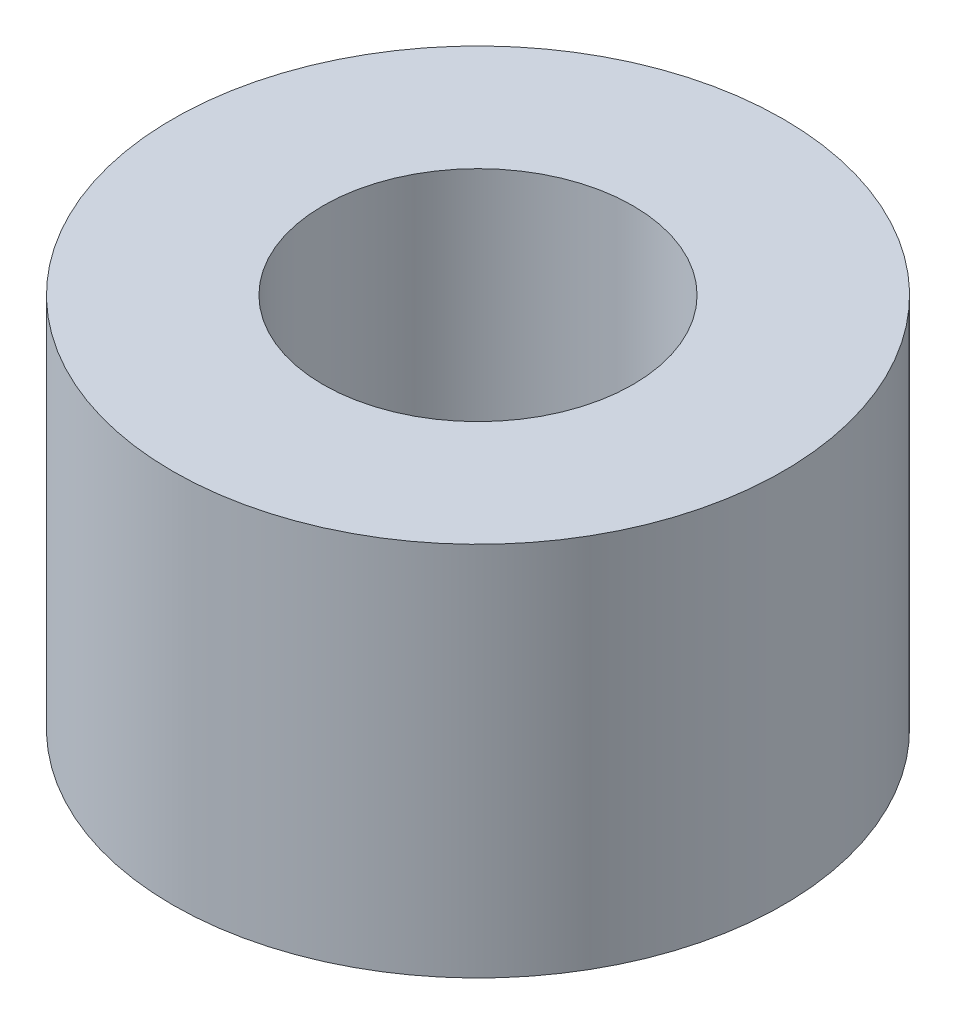
ISO-10303-21;
HEADER;
FILE_DESCRIPTION(('STEP AP214'),'2;1');
FILE_NAME('part.step','',(''),(''),'','','');
FILE_SCHEMA(('AUTOMOTIVE_DESIGN { 1 0 10303 214 1 1 1 1 }'));
ENDSEC;
DATA;
#1=APPLICATION_CONTEXT('core data for automotive mechanical design processes');
#2=APPLICATION_PROTOCOL_DEFINITION('international standard','automotive_design',2000,#1);
#3=PRODUCT_CONTEXT('',#1,'mechanical');
#4=PRODUCT('Part','Part','',(#3));
#5=PRODUCT_RELATED_PRODUCT_CATEGORY('part','',(#4));
#6=PRODUCT_DEFINITION_FORMATION('','',#4);
#7=PRODUCT_DEFINITION_CONTEXT('part definition',#1,'design');
#8=PRODUCT_DEFINITION('design','',#6,#7);
#9=PRODUCT_DEFINITION_SHAPE('','',#8);
#10=(LENGTH_UNIT() NAMED_UNIT(*) SI_UNIT(.MILLI.,.METRE.));
#11=(NAMED_UNIT(*) PLANE_ANGLE_UNIT() SI_UNIT($,.RADIAN.));
#12=(NAMED_UNIT(*) SI_UNIT($,.STERADIAN.) SOLID_ANGLE_UNIT());
#13=UNCERTAINTY_MEASURE_WITH_UNIT(LENGTH_MEASURE(1.E-05),#10,'distance_accuracy_value','');
#14=(GEOMETRIC_REPRESENTATION_CONTEXT(3) GLOBAL_UNCERTAINTY_ASSIGNED_CONTEXT((#13)) GLOBAL_UNIT_ASSIGNED_CONTEXT((#10,
#11,#12)) REPRESENTATION_CONTEXT('',''));
#15=CARTESIAN_POINT('',(0.,0.,0.));
#16=DIRECTION('',(0.,0.,1.));
#17=DIRECTION('',(1.,0.,0.));
#18=AXIS2_PLACEMENT_3D('',#15,#16,#17);
#19=CARTESIAN_POINT('',(0.,4.,0.));
#20=DIRECTION('',(0.,1.,0.));
#21=DIRECTION('',(0.,0.,1.));
#22=AXIS2_PLACEMENT_3D('',#19,#20,#21);
#23=PLANE('',#22);
#24=CARTESIAN_POINT('',(0.,4.,0.));
#25=DIRECTION('',(0.,1.,0.));
#26=DIRECTION('',(0.,0.,1.));
#27=AXIS2_PLACEMENT_3D('',#24,#25,#26);
#28=CIRCLE('',#27,3.25);
#29=CARTESIAN_POINT('',(0.,4.,3.25));
#30=VERTEX_POINT('',#29);
#31=EDGE_CURVE('E10',#30,#30,#28,.T.);
#32=ORIENTED_EDGE('',*,*,#31,.T.);
#33=EDGE_LOOP('',(#32));
#34=FACE_BOUND('',#33,.T.);
#35=CARTESIAN_POINT('',(0.,4.,0.));
#36=DIRECTION('',(0.,1.,0.));
#37=DIRECTION('',(0.,0.,1.));
#38=AXIS2_PLACEMENT_3D('',#35,#36,#37);
#39=CIRCLE('',#38,1.65);
#40=CARTESIAN_POINT('',(0.,4.,1.65));
#41=VERTEX_POINT('',#40);
#42=EDGE_CURVE('E42',#41,#41,#39,.T.);
#43=ORIENTED_EDGE('',*,*,#42,.F.);
#44=EDGE_LOOP('',(#43));
#45=FACE_BOUND('',#44,.T.);
#46=ADVANCED_FACE('F31',(#34,#45),#23,.T.);
#47=CARTESIAN_POINT('',(0.,0.,0.));
#48=DIRECTION('',(0.,1.,0.));
#49=DIRECTION('',(0.,0.,1.));
#50=AXIS2_PLACEMENT_3D('',#47,#48,#49);
#51=PLANE('',#50);
#52=CARTESIAN_POINT('',(0.,0.,0.));
#53=DIRECTION('',(0.,1.,0.));
#54=DIRECTION('',(0.,0.,1.));
#55=AXIS2_PLACEMENT_3D('',#52,#53,#54);
#56=CIRCLE('',#55,3.25);
#57=CARTESIAN_POINT('',(0.,0.,3.25));
#58=VERTEX_POINT('',#57);
#59=EDGE_CURVE('E35',#58,#58,#56,.T.);
#60=ORIENTED_EDGE('',*,*,#59,.F.);
#61=EDGE_LOOP('',(#60));
#62=FACE_BOUND('',#61,.T.);
#63=CARTESIAN_POINT('',(0.,0.,0.));
#64=DIRECTION('',(0.,1.,0.));
#65=DIRECTION('',(0.,0.,1.));
#66=AXIS2_PLACEMENT_3D('',#63,#64,#65);
#67=CIRCLE('',#66,1.65);
#68=CARTESIAN_POINT('',(0.,0.,1.65));
#69=VERTEX_POINT('',#68);
#70=EDGE_CURVE('E44',#69,#69,#67,.T.);
#71=ORIENTED_EDGE('',*,*,#70,.T.);
#72=EDGE_LOOP('',(#71));
#73=FACE_BOUND('',#72,.T.);
#74=ADVANCED_FACE('F54',(#62,#73),#51,.F.);
#75=CARTESIAN_POINT('',(0.,4.,0.));
#76=DIRECTION('',(0.,-1.,0.));
#77=DIRECTION('',(0.,0.,-1.));
#78=AXIS2_PLACEMENT_3D('',#75,#76,#77);
#79=CYLINDRICAL_SURFACE('',#78,3.25);
#80=ORIENTED_EDGE('',*,*,#31,.F.);
#81=EDGE_LOOP('',(#80));
#82=FACE_BOUND('',#81,.T.);
#83=ORIENTED_EDGE('',*,*,#59,.T.);
#84=EDGE_LOOP('',(#83));
#85=FACE_BOUND('',#84,.T.);
#86=ADVANCED_FACE('F33',(#82,#85),#79,.T.);
#87=CARTESIAN_POINT('',(0.,4.,0.));
#88=DIRECTION('',(0.,-1.,0.));
#89=DIRECTION('',(0.,0.,-1.));
#90=AXIS2_PLACEMENT_3D('',#87,#88,#89);
#91=CYLINDRICAL_SURFACE('',#90,1.65);
#92=ORIENTED_EDGE('',*,*,#42,.T.);
#93=EDGE_LOOP('',(#92));
#94=FACE_BOUND('',#93,.T.);
#95=ORIENTED_EDGE('',*,*,#70,.F.);
#96=EDGE_LOOP('',(#95));
#97=FACE_BOUND('',#96,.T.);
#98=ADVANCED_FACE('F50',(#94,#97),#91,.F.);
#99=CLOSED_SHELL('',(#46,#74,#86,#98));
#100=MANIFOLD_SOLID_BREP('B2',#99);
#101=ADVANCED_BREP_SHAPE_REPRESENTATION('',(#18,#100),#14);
#102=SHAPE_DEFINITION_REPRESENTATION(#9,#101);
ENDSEC;
END-ISO-10303-21;
